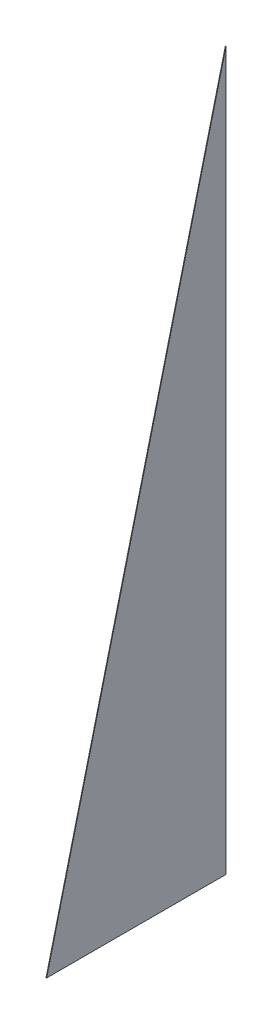
ISO-10303-21;
HEADER;
FILE_DESCRIPTION(('STEP AP214'),'2;1');
FILE_NAME('part.step','',(''),(''),'','','');
FILE_SCHEMA(('AUTOMOTIVE_DESIGN { 1 0 10303 214 1 1 1 1 }'));
ENDSEC;
DATA;
#1=APPLICATION_CONTEXT('core data for automotive mechanical design processes');
#2=APPLICATION_PROTOCOL_DEFINITION('international standard','automotive_design',2000,#1);
#3=PRODUCT_CONTEXT('',#1,'mechanical');
#4=PRODUCT('Part','Part','',(#3));
#5=PRODUCT_RELATED_PRODUCT_CATEGORY('part','',(#4));
#6=PRODUCT_DEFINITION_FORMATION('','',#4);
#7=PRODUCT_DEFINITION_CONTEXT('part definition',#1,'design');
#8=PRODUCT_DEFINITION('design','',#6,#7);
#9=PRODUCT_DEFINITION_SHAPE('','',#8);
#10=(LENGTH_UNIT() NAMED_UNIT(*) SI_UNIT(.MILLI.,.METRE.));
#11=(NAMED_UNIT(*) PLANE_ANGLE_UNIT() SI_UNIT($,.RADIAN.));
#12=(NAMED_UNIT(*) SI_UNIT($,.STERADIAN.) SOLID_ANGLE_UNIT());
#13=UNCERTAINTY_MEASURE_WITH_UNIT(LENGTH_MEASURE(1.E-05),#10,'distance_accuracy_value','');
#14=(GEOMETRIC_REPRESENTATION_CONTEXT(3) GLOBAL_UNCERTAINTY_ASSIGNED_CONTEXT((#13)) GLOBAL_UNIT_ASSIGNED_CONTEXT((#10,
#11,#12)) REPRESENTATION_CONTEXT('',''));
#15=CARTESIAN_POINT('',(0.,0.,0.));
#16=DIRECTION('',(0.,0.,1.));
#17=DIRECTION('',(1.,0.,0.));
#18=AXIS2_PLACEMENT_3D('',#15,#16,#17);
#19=CARTESIAN_POINT('',(1.,0.,300.));
#20=DIRECTION('',(0.,1.,0.));
#21=DIRECTION('',(0.,0.,1.));
#22=AXIS2_PLACEMENT_3D('',#19,#20,#21);
#23=PLANE('',#22);
#24=DIRECTION('',(0.,0.,-1.));
#25=VECTOR('',#24,1.);
#26=CARTESIAN_POINT('',(0.,0.,300.));
#27=LINE('',#26,#25);
#28=CARTESIAN_POINT('',(0.,0.,300.));
#29=VERTEX_POINT('',#28);
#30=CARTESIAN_POINT('',(0.,0.,0.));
#31=VERTEX_POINT('',#30);
#32=EDGE_CURVE('E92',#29,#31,#27,.T.);
#33=ORIENTED_EDGE('',*,*,#32,.T.);
#34=DIRECTION('',(-1.,0.,0.));
#35=VECTOR('',#34,1.);
#36=CARTESIAN_POINT('',(1.,0.,0.));
#37=LINE('',#36,#35);
#38=CARTESIAN_POINT('',(1.,0.,0.));
#39=VERTEX_POINT('',#38);
#40=EDGE_CURVE('E11',#39,#31,#37,.T.);
#41=ORIENTED_EDGE('',*,*,#40,.F.);
#42=DIRECTION('',(0.,0.,-1.));
#43=VECTOR('',#42,1.);
#44=CARTESIAN_POINT('',(1.,0.,300.));
#45=LINE('',#44,#43);
#46=CARTESIAN_POINT('',(1.,0.,300.));
#47=VERTEX_POINT('',#46);
#48=EDGE_CURVE('E84',#47,#39,#45,.T.);
#49=ORIENTED_EDGE('',*,*,#48,.F.);
#50=DIRECTION('',(-1.,0.,0.));
#51=VECTOR('',#50,1.);
#52=CARTESIAN_POINT('',(1.,0.,300.));
#53=LINE('',#52,#51);
#54=EDGE_CURVE('E93',#47,#29,#53,.T.);
#55=ORIENTED_EDGE('',*,*,#54,.T.);
#56=EDGE_LOOP('',(#33,#41,#49,#55));
#57=FACE_BOUND('',#56,.T.);
#58=ADVANCED_FACE('F42',(#57),#23,.F.);
#59=CARTESIAN_POINT('',(1.,0.,0.));
#60=DIRECTION('',(0.,0.,1.));
#61=DIRECTION('',(1.,0.,0.));
#62=AXIS2_PLACEMENT_3D('',#59,#60,#61);
#63=PLANE('',#62);
#64=DIRECTION('',(0.,1.,0.));
#65=VECTOR('',#64,1.);
#66=CARTESIAN_POINT('',(0.,0.,0.));
#67=LINE('',#66,#65);
#68=CARTESIAN_POINT('',(0.,1200.,0.));
#69=VERTEX_POINT('',#68);
#70=EDGE_CURVE('E71',#31,#69,#67,.T.);
#71=ORIENTED_EDGE('',*,*,#70,.T.);
#72=DIRECTION('',(-1.,0.,0.));
#73=VECTOR('',#72,1.);
#74=CARTESIAN_POINT('',(1.,1200.,0.));
#75=LINE('',#74,#73);
#76=CARTESIAN_POINT('',(1.,1200.,0.));
#77=VERTEX_POINT('',#76);
#78=EDGE_CURVE('E51',#77,#69,#75,.T.);
#79=ORIENTED_EDGE('',*,*,#78,.F.);
#80=DIRECTION('',(0.,1.,0.));
#81=VECTOR('',#80,1.);
#82=CARTESIAN_POINT('',(1.,0.,0.));
#83=LINE('',#82,#81);
#84=EDGE_CURVE('E79',#39,#77,#83,.T.);
#85=ORIENTED_EDGE('',*,*,#84,.F.);
#86=ORIENTED_EDGE('',*,*,#40,.T.);
#87=EDGE_LOOP('',(#71,#79,#85,#86));
#88=FACE_BOUND('',#87,.T.);
#89=ADVANCED_FACE('F80',(#88),#63,.F.);
#90=CARTESIAN_POINT('',(1.,1200.,0.));
#91=DIRECTION('',(0.,-0.242535625036333,-0.970142500145332));
#92=DIRECTION('',(0.,0.970142500145332,-0.242535625036333));
#93=AXIS2_PLACEMENT_3D('',#90,#91,#92);
#94=PLANE('',#93);
#95=DIRECTION('',(0.,-0.970142500145332,0.242535625036333));
#96=VECTOR('',#95,1.);
#97=CARTESIAN_POINT('',(0.,1200.,0.));
#98=LINE('',#97,#96);
#99=EDGE_CURVE('E76',#69,#29,#98,.T.);
#100=ORIENTED_EDGE('',*,*,#99,.T.);
#101=ORIENTED_EDGE('',*,*,#54,.F.);
#102=DIRECTION('',(0.,-0.970142500145332,0.242535625036333));
#103=VECTOR('',#102,1.);
#104=CARTESIAN_POINT('',(1.,1200.,0.));
#105=LINE('',#104,#103);
#106=EDGE_CURVE('E59',#77,#47,#105,.T.);
#107=ORIENTED_EDGE('',*,*,#106,.F.);
#108=ORIENTED_EDGE('',*,*,#78,.T.);
#109=EDGE_LOOP('',(#100,#101,#107,#108));
#110=FACE_BOUND('',#109,.T.);
#111=ADVANCED_FACE('F105',(#110),#94,.F.);
#112=CARTESIAN_POINT('',(1.,0.,0.));
#113=DIRECTION('',(1.,0.,0.));
#114=DIRECTION('',(0.,0.,-1.));
#115=AXIS2_PLACEMENT_3D('',#112,#113,#114);
#116=PLANE('',#115);
#117=ORIENTED_EDGE('',*,*,#48,.T.);
#118=ORIENTED_EDGE('',*,*,#84,.T.);
#119=ORIENTED_EDGE('',*,*,#106,.T.);
#120=EDGE_LOOP('',(#117,#118,#119));
#121=FACE_BOUND('',#120,.T.);
#122=ADVANCED_FACE('F87',(#121),#116,.T.);
#123=CARTESIAN_POINT('',(0.,0.,0.));
#124=DIRECTION('',(1.,0.,0.));
#125=DIRECTION('',(0.,0.,-1.));
#126=AXIS2_PLACEMENT_3D('',#123,#124,#125);
#127=PLANE('',#126);
#128=ORIENTED_EDGE('',*,*,#32,.F.);
#129=ORIENTED_EDGE('',*,*,#99,.F.);
#130=ORIENTED_EDGE('',*,*,#70,.F.);
#131=EDGE_LOOP('',(#128,#129,#130));
#132=FACE_BOUND('',#131,.T.);
#133=ADVANCED_FACE('F106',(#132),#127,.F.);
#134=CLOSED_SHELL('',(#58,#89,#111,#122,#133));
#135=MANIFOLD_SOLID_BREP('B2',#134);
#136=ADVANCED_BREP_SHAPE_REPRESENTATION('',(#18,#135),#14);
#137=SHAPE_DEFINITION_REPRESENTATION(#9,#136);
ENDSEC;
END-ISO-10303-21;
